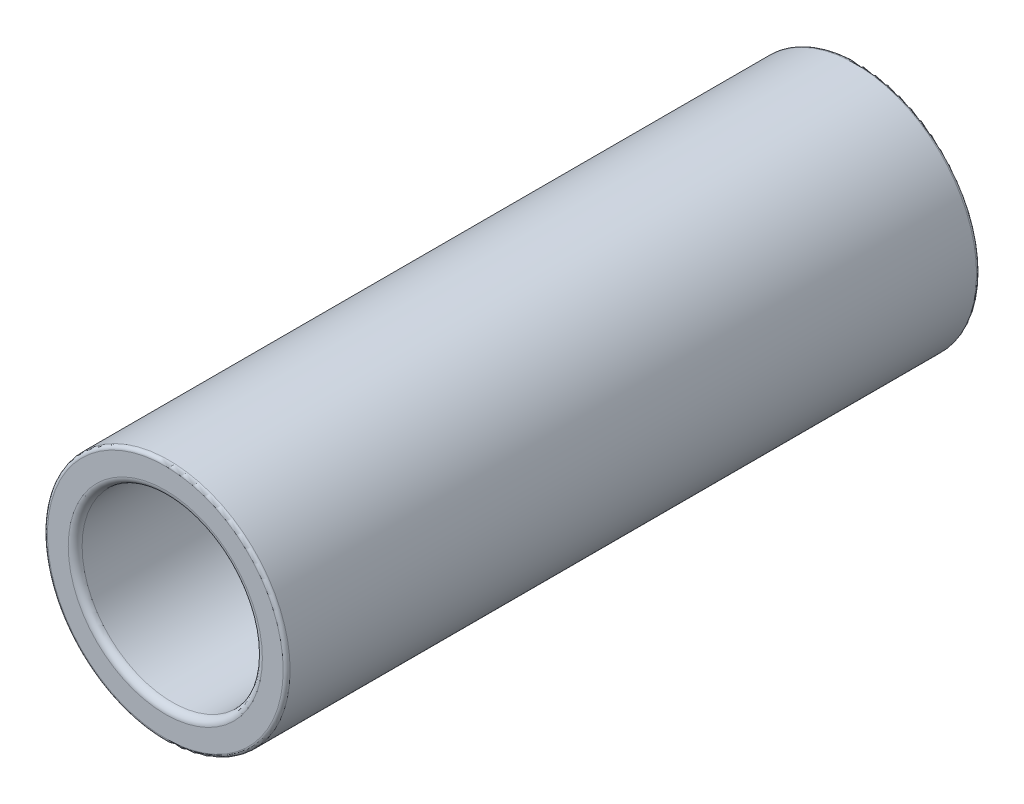
ISO-10303-21;
HEADER;
FILE_DESCRIPTION(('STEP AP214'),'2;1');
FILE_NAME('part.step','',(''),(''),'','','');
FILE_SCHEMA(('AUTOMOTIVE_DESIGN { 1 0 10303 214 1 1 1 1 }'));
ENDSEC;
DATA;
#1=APPLICATION_CONTEXT('core data for automotive mechanical design processes');
#2=APPLICATION_PROTOCOL_DEFINITION('international standard','automotive_design',2000,#1);
#3=PRODUCT_CONTEXT('',#1,'mechanical');
#4=PRODUCT('Part','Part','',(#3));
#5=PRODUCT_RELATED_PRODUCT_CATEGORY('part','',(#4));
#6=PRODUCT_DEFINITION_FORMATION('','',#4);
#7=PRODUCT_DEFINITION_CONTEXT('part definition',#1,'design');
#8=PRODUCT_DEFINITION('design','',#6,#7);
#9=PRODUCT_DEFINITION_SHAPE('','',#8);
#10=(LENGTH_UNIT() NAMED_UNIT(*) SI_UNIT(.MILLI.,.METRE.));
#11=(NAMED_UNIT(*) PLANE_ANGLE_UNIT() SI_UNIT($,.RADIAN.));
#12=(NAMED_UNIT(*) SI_UNIT($,.STERADIAN.) SOLID_ANGLE_UNIT());
#13=UNCERTAINTY_MEASURE_WITH_UNIT(LENGTH_MEASURE(1.E-05),#10,'distance_accuracy_value','');
#14=(GEOMETRIC_REPRESENTATION_CONTEXT(3) GLOBAL_UNCERTAINTY_ASSIGNED_CONTEXT((#13)) GLOBAL_UNIT_ASSIGNED_CONTEXT((#10,
#11,#12)) REPRESENTATION_CONTEXT('',''));
#15=CARTESIAN_POINT('',(0.,0.,0.));
#16=DIRECTION('',(0.,0.,1.));
#17=DIRECTION('',(1.,0.,0.));
#18=AXIS2_PLACEMENT_3D('',#15,#16,#17);
#19=CARTESIAN_POINT('',(0.,0.,20.));
#20=DIRECTION('',(0.,0.,1.));
#21=DIRECTION('',(1.,0.,0.));
#22=AXIS2_PLACEMENT_3D('',#19,#20,#21);
#23=PLANE('',#22);
#24=CARTESIAN_POINT('',(0.,0.,20.));
#25=DIRECTION('',(0.,0.,1.));
#26=DIRECTION('',(1.,0.,0.));
#27=AXIS2_PLACEMENT_3D('',#24,#25,#26);
#28=CIRCLE('',#27,2.8);
#29=CARTESIAN_POINT('',(2.8,0.,20.));
#30=VERTEX_POINT('',#29);
#31=EDGE_CURVE('E10',#30,#30,#28,.F.);
#32=ORIENTED_EDGE('',*,*,#31,.T.);
#33=EDGE_LOOP('',(#32));
#34=FACE_BOUND('',#33,.T.);
#35=CARTESIAN_POINT('',(0.,0.,20.));
#36=DIRECTION('',(0.,0.,1.));
#37=DIRECTION('',(1.,0.,0.));
#38=AXIS2_PLACEMENT_3D('',#35,#36,#37);
#39=CIRCLE('',#38,3.4);
#40=CARTESIAN_POINT('',(3.4,0.,20.));
#41=VERTEX_POINT('',#40);
#42=EDGE_CURVE('E61',#41,#41,#39,.T.);
#43=ORIENTED_EDGE('',*,*,#42,.T.);
#44=EDGE_LOOP('',(#43));
#45=FACE_BOUND('',#44,.T.);
#46=ADVANCED_FACE('F37',(#34,#45),#23,.T.);
#47=CARTESIAN_POINT('',(0.,0.,0.));
#48=DIRECTION('',(0.,0.,1.));
#49=DIRECTION('',(1.,0.,0.));
#50=AXIS2_PLACEMENT_3D('',#47,#48,#49);
#51=PLANE('',#50);
#52=CARTESIAN_POINT('',(0.,0.,0.));
#53=DIRECTION('',(0.,0.,1.));
#54=DIRECTION('',(1.,0.,0.));
#55=AXIS2_PLACEMENT_3D('',#52,#53,#54);
#56=CIRCLE('',#55,2.8);
#57=CARTESIAN_POINT('',(2.8,0.,0.));
#58=VERTEX_POINT('',#57);
#59=EDGE_CURVE('E55',#58,#58,#56,.T.);
#60=ORIENTED_EDGE('',*,*,#59,.T.);
#61=EDGE_LOOP('',(#60));
#62=FACE_BOUND('',#61,.T.);
#63=CARTESIAN_POINT('',(0.,0.,0.));
#64=DIRECTION('',(0.,0.,1.));
#65=DIRECTION('',(1.,0.,0.));
#66=AXIS2_PLACEMENT_3D('',#63,#64,#65);
#67=CIRCLE('',#66,3.4);
#68=CARTESIAN_POINT('',(3.4,0.,0.));
#69=VERTEX_POINT('',#68);
#70=EDGE_CURVE('E65',#69,#69,#67,.F.);
#71=ORIENTED_EDGE('',*,*,#70,.T.);
#72=EDGE_LOOP('',(#71));
#73=FACE_BOUND('',#72,.T.);
#74=ADVANCED_FACE('F89',(#62,#73),#51,.F.);
#75=CARTESIAN_POINT('',(0.,0.,20.));
#76=DIRECTION('',(0.,0.,-1.));
#77=DIRECTION('',(-1.,0.,0.));
#78=AXIS2_PLACEMENT_3D('',#75,#76,#77);
#79=CYLINDRICAL_SURFACE('',#78,3.5);
#80=CARTESIAN_POINT('',(0.,0.,0.0999999999999994));
#81=DIRECTION('',(0.,0.,1.));
#82=DIRECTION('',(1.,0.,0.));
#83=AXIS2_PLACEMENT_3D('',#80,#81,#82);
#84=CIRCLE('',#83,3.5);
#85=CARTESIAN_POINT('',(3.5,0.,0.0999999999999994));
#86=VERTEX_POINT('',#85);
#87=EDGE_CURVE('E69',#86,#86,#84,.T.);
#88=ORIENTED_EDGE('',*,*,#87,.T.);
#89=EDGE_LOOP('',(#88));
#90=FACE_BOUND('',#89,.T.);
#91=CARTESIAN_POINT('',(0.,0.,19.9));
#92=DIRECTION('',(0.,0.,1.));
#93=DIRECTION('',(1.,0.,0.));
#94=AXIS2_PLACEMENT_3D('',#91,#92,#93);
#95=CIRCLE('',#94,3.5);
#96=CARTESIAN_POINT('',(3.5,0.,19.9));
#97=VERTEX_POINT('',#96);
#98=EDGE_CURVE('E73',#97,#97,#95,.F.);
#99=ORIENTED_EDGE('',*,*,#98,.T.);
#100=EDGE_LOOP('',(#99));
#101=FACE_BOUND('',#100,.T.);
#102=ADVANCED_FACE('F78',(#90,#101),#79,.T.);
#103=CARTESIAN_POINT('',(0.,0.,20.));
#104=DIRECTION('',(0.,0.,-1.));
#105=DIRECTION('',(-1.,0.,0.));
#106=AXIS2_PLACEMENT_3D('',#103,#104,#105);
#107=CYLINDRICAL_SURFACE('',#106,2.6);
#108=CARTESIAN_POINT('',(0.,0.,0.199999999999999));
#109=DIRECTION('',(0.,0.,1.));
#110=DIRECTION('',(1.,0.,0.));
#111=AXIS2_PLACEMENT_3D('',#108,#109,#110);
#112=CIRCLE('',#111,2.6);
#113=CARTESIAN_POINT('',(2.6,0.,0.199999999999999));
#114=VERTEX_POINT('',#113);
#115=EDGE_CURVE('E45',#114,#114,#112,.F.);
#116=ORIENTED_EDGE('',*,*,#115,.T.);
#117=EDGE_LOOP('',(#116));
#118=FACE_BOUND('',#117,.T.);
#119=CARTESIAN_POINT('',(0.,0.,19.8));
#120=DIRECTION('',(0.,0.,1.));
#121=DIRECTION('',(1.,0.,0.));
#122=AXIS2_PLACEMENT_3D('',#119,#120,#121);
#123=CIRCLE('',#122,2.6);
#124=CARTESIAN_POINT('',(2.6,0.,19.8));
#125=VERTEX_POINT('',#124);
#126=EDGE_CURVE('E50',#125,#125,#123,.T.);
#127=ORIENTED_EDGE('',*,*,#126,.T.);
#128=EDGE_LOOP('',(#127));
#129=FACE_BOUND('',#128,.T.);
#130=ADVANCED_FACE('F97',(#118,#129),#107,.F.);
#131=CARTESIAN_POINT('',(0.,0.,0.0999999999999994));
#132=DIRECTION('',(0.,0.,1.));
#133=DIRECTION('',(1.,0.,0.));
#134=AXIS2_PLACEMENT_3D('',#131,#132,#133);
#135=TOROIDAL_SURFACE('',#134,3.4,0.1);
#136=ORIENTED_EDGE('',*,*,#70,.F.);
#137=EDGE_LOOP('',(#136));
#138=FACE_BOUND('',#137,.T.);
#139=ORIENTED_EDGE('',*,*,#87,.F.);
#140=EDGE_LOOP('',(#139));
#141=FACE_BOUND('',#140,.T.);
#142=ADVANCED_FACE('F84',(#138,#141),#135,.T.);
#143=CARTESIAN_POINT('',(0.,0.,19.9));
#144=DIRECTION('',(0.,0.,1.));
#145=DIRECTION('',(1.,0.,0.));
#146=AXIS2_PLACEMENT_3D('',#143,#144,#145);
#147=TOROIDAL_SURFACE('',#146,3.4,0.1);
#148=ORIENTED_EDGE('',*,*,#98,.F.);
#149=EDGE_LOOP('',(#148));
#150=FACE_BOUND('',#149,.T.);
#151=ORIENTED_EDGE('',*,*,#42,.F.);
#152=EDGE_LOOP('',(#151));
#153=FACE_BOUND('',#152,.T.);
#154=ADVANCED_FACE('F80',(#150,#153),#147,.T.);
#155=CARTESIAN_POINT('',(0.,0.,0.199999999999999));
#156=DIRECTION('',(0.,0.,1.));
#157=DIRECTION('',(1.,0.,0.));
#158=AXIS2_PLACEMENT_3D('',#155,#156,#157);
#159=TOROIDAL_SURFACE('',#158,2.8,0.2);
#160=ORIENTED_EDGE('',*,*,#115,.F.);
#161=EDGE_LOOP('',(#160));
#162=FACE_BOUND('',#161,.T.);
#163=ORIENTED_EDGE('',*,*,#59,.F.);
#164=EDGE_LOOP('',(#163));
#165=FACE_BOUND('',#164,.T.);
#166=ADVANCED_FACE('F83',(#162,#165),#159,.T.);
#167=CARTESIAN_POINT('',(0.,0.,19.8));
#168=DIRECTION('',(0.,0.,1.));
#169=DIRECTION('',(1.,0.,0.));
#170=AXIS2_PLACEMENT_3D('',#167,#168,#169);
#171=TOROIDAL_SURFACE('',#170,2.8,0.2);
#172=ORIENTED_EDGE('',*,*,#31,.F.);
#173=EDGE_LOOP('',(#172));
#174=FACE_BOUND('',#173,.T.);
#175=ORIENTED_EDGE('',*,*,#126,.F.);
#176=EDGE_LOOP('',(#175));
#177=FACE_BOUND('',#176,.T.);
#178=ADVANCED_FACE('F39',(#174,#177),#171,.T.);
#179=CLOSED_SHELL('',(#46,#74,#102,#130,#142,#154,#166,#178));
#180=MANIFOLD_SOLID_BREP('B2',#179);
#181=ADVANCED_BREP_SHAPE_REPRESENTATION('',(#18,#180),#14);
#182=SHAPE_DEFINITION_REPRESENTATION(#9,#181);
ENDSEC;
END-ISO-10303-21;
